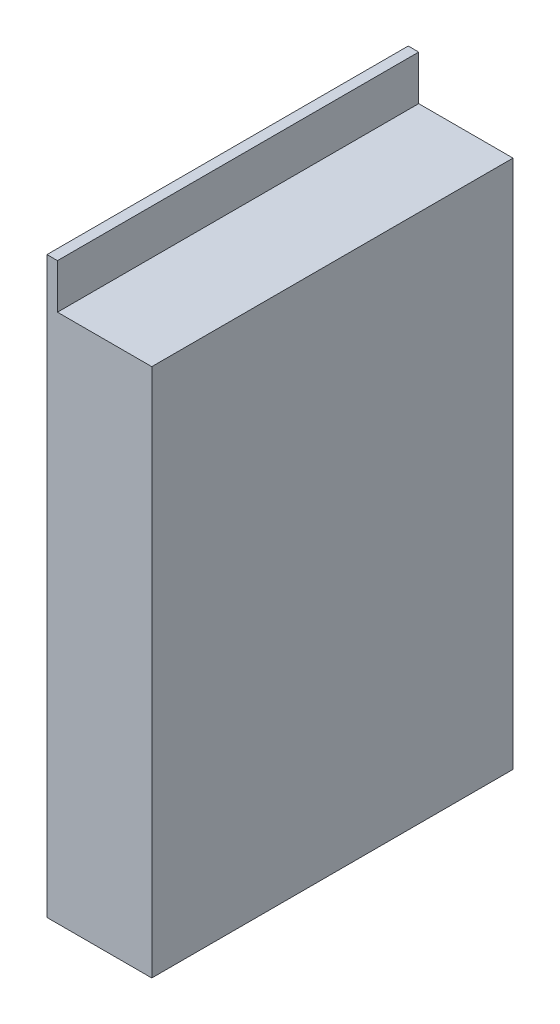
ISO-10303-21;
HEADER;
FILE_DESCRIPTION(('STEP AP214'),'2;1');
FILE_NAME('part.step','',(''),(''),'','','');
FILE_SCHEMA(('AUTOMOTIVE_DESIGN { 1 0 10303 214 1 1 1 1 }'));
ENDSEC;
DATA;
#1=APPLICATION_CONTEXT('core data for automotive mechanical design processes');
#2=APPLICATION_PROTOCOL_DEFINITION('international standard','automotive_design',2000,#1);
#3=PRODUCT_CONTEXT('',#1,'mechanical');
#4=PRODUCT('Part','Part','',(#3));
#5=PRODUCT_RELATED_PRODUCT_CATEGORY('part','',(#4));
#6=PRODUCT_DEFINITION_FORMATION('','',#4);
#7=PRODUCT_DEFINITION_CONTEXT('part definition',#1,'design');
#8=PRODUCT_DEFINITION('design','',#6,#7);
#9=PRODUCT_DEFINITION_SHAPE('','',#8);
#10=(LENGTH_UNIT() NAMED_UNIT(*) SI_UNIT(.MILLI.,.METRE.));
#11=(NAMED_UNIT(*) PLANE_ANGLE_UNIT() SI_UNIT($,.RADIAN.));
#12=(NAMED_UNIT(*) SI_UNIT($,.STERADIAN.) SOLID_ANGLE_UNIT());
#13=UNCERTAINTY_MEASURE_WITH_UNIT(LENGTH_MEASURE(1.E-05),#10,'distance_accuracy_value','');
#14=(GEOMETRIC_REPRESENTATION_CONTEXT(3) GLOBAL_UNCERTAINTY_ASSIGNED_CONTEXT((#13)) GLOBAL_UNIT_ASSIGNED_CONTEXT((#10,
#11,#12)) REPRESENTATION_CONTEXT('',''));
#15=CARTESIAN_POINT('',(0.,0.,0.));
#16=DIRECTION('',(0.,0.,1.));
#17=DIRECTION('',(1.,0.,0.));
#18=AXIS2_PLACEMENT_3D('',#15,#16,#17);
#19=CARTESIAN_POINT('',(19.,96.,0.));
#20=DIRECTION('',(0.,-1.,0.));
#21=DIRECTION('',(0.,0.,-1.));
#22=AXIS2_PLACEMENT_3D('',#19,#20,#21);
#23=PLANE('',#22);
#24=DIRECTION('',(0.,0.,-1.));
#25=VECTOR('',#24,1.);
#26=CARTESIAN_POINT('',(1.9,96.,-65.5));
#27=LINE('',#26,#25);
#28=CARTESIAN_POINT('',(1.9,96.,0.));
#29=VERTEX_POINT('',#28);
#30=CARTESIAN_POINT('',(1.9,96.,-65.5));
#31=VERTEX_POINT('',#30);
#32=EDGE_CURVE('E49',#29,#31,#27,.T.);
#33=ORIENTED_EDGE('',*,*,#32,.F.);
#34=DIRECTION('',(-1.,0.,0.));
#35=VECTOR('',#34,1.);
#36=CARTESIAN_POINT('',(19.,96.,0.));
#37=LINE('',#36,#35);
#38=CARTESIAN_POINT('',(19.,96.,0.));
#39=VERTEX_POINT('',#38);
#40=EDGE_CURVE('E129',#39,#29,#37,.T.);
#41=ORIENTED_EDGE('',*,*,#40,.F.);
#42=DIRECTION('',(0.,0.,1.));
#43=VECTOR('',#42,1.);
#44=CARTESIAN_POINT('',(19.,96.,0.));
#45=LINE('',#44,#43);
#46=CARTESIAN_POINT('',(19.,96.,-65.5));
#47=VERTEX_POINT('',#46);
#48=EDGE_CURVE('E58',#47,#39,#45,.T.);
#49=ORIENTED_EDGE('',*,*,#48,.F.);
#50=DIRECTION('',(-1.,0.,0.));
#51=VECTOR('',#50,1.);
#52=CARTESIAN_POINT('',(19.,96.,-65.5));
#53=LINE('',#52,#51);
#54=EDGE_CURVE('E134',#47,#31,#53,.T.);
#55=ORIENTED_EDGE('',*,*,#54,.T.);
#56=EDGE_LOOP('',(#33,#41,#49,#55));
#57=FACE_BOUND('',#56,.T.);
#58=ADVANCED_FACE('F34',(#57),#23,.F.);
#59=CARTESIAN_POINT('',(19.,0.,0.));
#60=DIRECTION('',(0.,0.,-1.));
#61=DIRECTION('',(-1.,0.,0.));
#62=AXIS2_PLACEMENT_3D('',#59,#60,#61);
#63=PLANE('',#62);
#64=DIRECTION('',(0.,-1.,0.));
#65=VECTOR('',#64,1.);
#66=CARTESIAN_POINT('',(0.,0.,0.));
#67=LINE('',#66,#65);
#68=CARTESIAN_POINT('',(0.,104.1,0.));
#69=VERTEX_POINT('',#68);
#70=CARTESIAN_POINT('',(0.,0.,0.));
#71=VERTEX_POINT('',#70);
#72=EDGE_CURVE('E93',#69,#71,#67,.T.);
#73=ORIENTED_EDGE('',*,*,#72,.T.);
#74=DIRECTION('',(-1.,0.,0.));
#75=VECTOR('',#74,1.);
#76=CARTESIAN_POINT('',(19.,0.,0.));
#77=LINE('',#76,#75);
#78=CARTESIAN_POINT('',(19.,0.,0.));
#79=VERTEX_POINT('',#78);
#80=EDGE_CURVE('E11',#79,#71,#77,.T.);
#81=ORIENTED_EDGE('',*,*,#80,.F.);
#82=DIRECTION('',(0.,-1.,0.));
#83=VECTOR('',#82,1.);
#84=CARTESIAN_POINT('',(19.,0.,0.));
#85=LINE('',#84,#83);
#86=EDGE_CURVE('E123',#39,#79,#85,.T.);
#87=ORIENTED_EDGE('',*,*,#86,.F.);
#88=ORIENTED_EDGE('',*,*,#40,.T.);
#89=DIRECTION('',(0.,-1.,0.));
#90=VECTOR('',#89,1.);
#91=CARTESIAN_POINT('',(1.90000000000001,104.1,0.));
#92=LINE('',#91,#90);
#93=CARTESIAN_POINT('',(1.90000000000001,104.1,0.));
#94=VERTEX_POINT('',#93);
#95=EDGE_CURVE('E101',#94,#29,#92,.T.);
#96=ORIENTED_EDGE('',*,*,#95,.F.);
#97=DIRECTION('',(1.,0.,0.));
#98=VECTOR('',#97,1.);
#99=CARTESIAN_POINT('',(0.,104.1,0.));
#100=LINE('',#99,#98);
#101=EDGE_CURVE('E104',#69,#94,#100,.T.);
#102=ORIENTED_EDGE('',*,*,#101,.F.);
#103=EDGE_LOOP('',(#73,#81,#87,#88,#96,#102));
#104=FACE_BOUND('',#103,.T.);
#105=ADVANCED_FACE('F36',(#104),#63,.F.);
#106=CARTESIAN_POINT('',(19.,0.,0.));
#107=DIRECTION('',(0.,1.,0.));
#108=DIRECTION('',(0.,0.,1.));
#109=AXIS2_PLACEMENT_3D('',#106,#107,#108);
#110=PLANE('',#109);
#111=DIRECTION('',(0.,0.,-1.));
#112=VECTOR('',#111,1.);
#113=CARTESIAN_POINT('',(0.,0.,0.));
#114=LINE('',#113,#112);
#115=CARTESIAN_POINT('',(0.,0.,-65.5));
#116=VERTEX_POINT('',#115);
#117=EDGE_CURVE('E71',#71,#116,#114,.T.);
#118=ORIENTED_EDGE('',*,*,#117,.T.);
#119=DIRECTION('',(-1.,0.,0.));
#120=VECTOR('',#119,1.);
#121=CARTESIAN_POINT('',(19.,0.,-65.5));
#122=LINE('',#121,#120);
#123=CARTESIAN_POINT('',(19.,0.,-65.5));
#124=VERTEX_POINT('',#123);
#125=EDGE_CURVE('E42',#124,#116,#122,.T.);
#126=ORIENTED_EDGE('',*,*,#125,.F.);
#127=DIRECTION('',(0.,0.,-1.));
#128=VECTOR('',#127,1.);
#129=CARTESIAN_POINT('',(19.,0.,0.));
#130=LINE('',#129,#128);
#131=EDGE_CURVE('E76',#79,#124,#130,.T.);
#132=ORIENTED_EDGE('',*,*,#131,.F.);
#133=ORIENTED_EDGE('',*,*,#80,.T.);
#134=EDGE_LOOP('',(#118,#126,#132,#133));
#135=FACE_BOUND('',#134,.T.);
#136=ADVANCED_FACE('F139',(#135),#110,.F.);
#137=CARTESIAN_POINT('',(19.,0.,-65.5));
#138=DIRECTION('',(0.,0.,1.));
#139=DIRECTION('',(0.,-1.,0.));
#140=AXIS2_PLACEMENT_3D('',#137,#138,#139);
#141=PLANE('',#140);
#142=DIRECTION('',(0.,1.,0.));
#143=VECTOR('',#142,1.);
#144=CARTESIAN_POINT('',(0.,0.,-65.5));
#145=LINE('',#144,#143);
#146=CARTESIAN_POINT('',(0.,104.1,-65.5));
#147=VERTEX_POINT('',#146);
#148=EDGE_CURVE('E125',#116,#147,#145,.T.);
#149=ORIENTED_EDGE('',*,*,#148,.T.);
#150=DIRECTION('',(-1.,0.,0.));
#151=VECTOR('',#150,1.);
#152=CARTESIAN_POINT('',(0.,104.1,-65.5));
#153=LINE('',#152,#151);
#154=CARTESIAN_POINT('',(1.9,104.1,-65.5));
#155=VERTEX_POINT('',#154);
#156=EDGE_CURVE('E113',#155,#147,#153,.T.);
#157=ORIENTED_EDGE('',*,*,#156,.F.);
#158=DIRECTION('',(0.,-1.,0.));
#159=VECTOR('',#158,1.);
#160=CARTESIAN_POINT('',(1.9,104.1,-65.5));
#161=LINE('',#160,#159);
#162=EDGE_CURVE('E118',#155,#31,#161,.T.);
#163=ORIENTED_EDGE('',*,*,#162,.T.);
#164=ORIENTED_EDGE('',*,*,#54,.F.);
#165=DIRECTION('',(0.,1.,0.));
#166=VECTOR('',#165,1.);
#167=CARTESIAN_POINT('',(19.,0.,-65.5));
#168=LINE('',#167,#166);
#169=EDGE_CURVE('E127',#124,#47,#168,.T.);
#170=ORIENTED_EDGE('',*,*,#169,.F.);
#171=ORIENTED_EDGE('',*,*,#125,.T.);
#172=EDGE_LOOP('',(#149,#157,#163,#164,#170,#171));
#173=FACE_BOUND('',#172,.T.);
#174=ADVANCED_FACE('F137',(#173),#141,.F.);
#175=CARTESIAN_POINT('',(19.,0.,0.));
#176=DIRECTION('',(-1.,0.,0.));
#177=DIRECTION('',(0.,0.,1.));
#178=AXIS2_PLACEMENT_3D('',#175,#176,#177);
#179=PLANE('',#178);
#180=ORIENTED_EDGE('',*,*,#86,.T.);
#181=ORIENTED_EDGE('',*,*,#131,.T.);
#182=ORIENTED_EDGE('',*,*,#169,.T.);
#183=ORIENTED_EDGE('',*,*,#48,.T.);
#184=EDGE_LOOP('',(#180,#181,#182,#183));
#185=FACE_BOUND('',#184,.T.);
#186=ADVANCED_FACE('F145',(#185),#179,.F.);
#187=CARTESIAN_POINT('',(0.,0.,0.));
#188=DIRECTION('',(-1.,0.,0.));
#189=DIRECTION('',(0.,0.,1.));
#190=AXIS2_PLACEMENT_3D('',#187,#188,#189);
#191=PLANE('',#190);
#192=ORIENTED_EDGE('',*,*,#72,.F.);
#193=DIRECTION('',(0.,0.,1.));
#194=VECTOR('',#193,1.);
#195=CARTESIAN_POINT('',(0.,104.1,-65.5));
#196=LINE('',#195,#194);
#197=EDGE_CURVE('E98',#147,#69,#196,.T.);
#198=ORIENTED_EDGE('',*,*,#197,.F.);
#199=ORIENTED_EDGE('',*,*,#148,.F.);
#200=ORIENTED_EDGE('',*,*,#117,.F.);
#201=EDGE_LOOP('',(#192,#198,#199,#200));
#202=FACE_BOUND('',#201,.T.);
#203=ADVANCED_FACE('F95',(#202),#191,.T.);
#204=CARTESIAN_POINT('',(1.9,104.1,-65.5));
#205=DIRECTION('',(-1.,0.,0.));
#206=DIRECTION('',(0.,0.,1.));
#207=AXIS2_PLACEMENT_3D('',#204,#205,#206);
#208=PLANE('',#207);
#209=ORIENTED_EDGE('',*,*,#32,.T.);
#210=ORIENTED_EDGE('',*,*,#162,.F.);
#211=DIRECTION('',(0.,0.,-1.));
#212=VECTOR('',#211,1.);
#213=CARTESIAN_POINT('',(1.9,104.1,-65.5));
#214=LINE('',#213,#212);
#215=EDGE_CURVE('E108',#94,#155,#214,.T.);
#216=ORIENTED_EDGE('',*,*,#215,.F.);
#217=ORIENTED_EDGE('',*,*,#95,.T.);
#218=EDGE_LOOP('',(#209,#210,#216,#217));
#219=FACE_BOUND('',#218,.T.);
#220=ADVANCED_FACE('F154',(#219),#208,.F.);
#221=CARTESIAN_POINT('',(0.,104.1,0.));
#222=DIRECTION('',(0.,1.,0.));
#223=DIRECTION('',(0.,0.,1.));
#224=AXIS2_PLACEMENT_3D('',#221,#222,#223);
#225=PLANE('',#224);
#226=ORIENTED_EDGE('',*,*,#197,.T.);
#227=ORIENTED_EDGE('',*,*,#101,.T.);
#228=ORIENTED_EDGE('',*,*,#215,.T.);
#229=ORIENTED_EDGE('',*,*,#156,.T.);
#230=EDGE_LOOP('',(#226,#227,#228,#229));
#231=FACE_BOUND('',#230,.T.);
#232=ADVANCED_FACE('F111',(#231),#225,.T.);
#233=CLOSED_SHELL('',(#58,#105,#136,#174,#186,#203,#220,#232));
#234=MANIFOLD_SOLID_BREP('B2',#233);
#235=ADVANCED_BREP_SHAPE_REPRESENTATION('',(#18,#234),#14);
#236=SHAPE_DEFINITION_REPRESENTATION(#9,#235);
ENDSEC;
END-ISO-10303-21;
